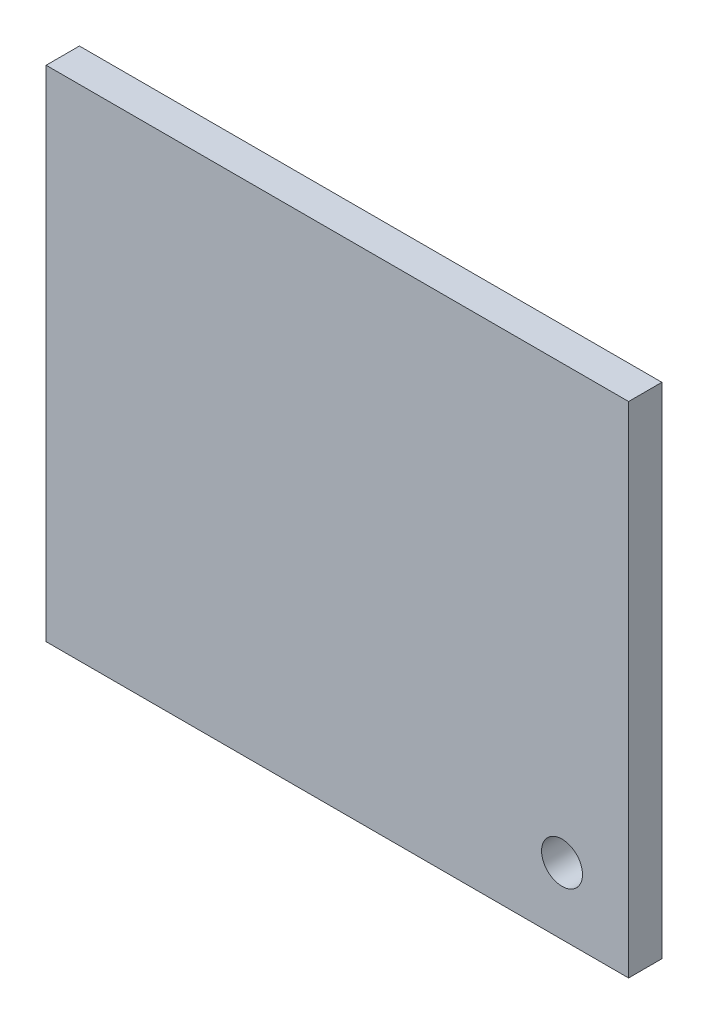
ISO-10303-21;
HEADER;
FILE_DESCRIPTION(('STEP AP214'),'2;1');
FILE_NAME('part.step','',(''),(''),'','','');
FILE_SCHEMA(('AUTOMOTIVE_DESIGN { 1 0 10303 214 1 1 1 1 }'));
ENDSEC;
DATA;
#1=APPLICATION_CONTEXT('core data for automotive mechanical design processes');
#2=APPLICATION_PROTOCOL_DEFINITION('international standard','automotive_design',2000,#1);
#3=PRODUCT_CONTEXT('',#1,'mechanical');
#4=PRODUCT('Part','Part','',(#3));
#5=PRODUCT_RELATED_PRODUCT_CATEGORY('part','',(#4));
#6=PRODUCT_DEFINITION_FORMATION('','',#4);
#7=PRODUCT_DEFINITION_CONTEXT('part definition',#1,'design');
#8=PRODUCT_DEFINITION('design','',#6,#7);
#9=PRODUCT_DEFINITION_SHAPE('','',#8);
#10=(LENGTH_UNIT() NAMED_UNIT(*) SI_UNIT(.MILLI.,.METRE.));
#11=(NAMED_UNIT(*) PLANE_ANGLE_UNIT() SI_UNIT($,.RADIAN.));
#12=(NAMED_UNIT(*) SI_UNIT($,.STERADIAN.) SOLID_ANGLE_UNIT());
#13=UNCERTAINTY_MEASURE_WITH_UNIT(LENGTH_MEASURE(1.E-05),#10,'distance_accuracy_value','');
#14=(GEOMETRIC_REPRESENTATION_CONTEXT(3) GLOBAL_UNCERTAINTY_ASSIGNED_CONTEXT((#13)) GLOBAL_UNIT_ASSIGNED_CONTEXT((#10,
#11,#12)) REPRESENTATION_CONTEXT('',''));
#15=CARTESIAN_POINT('',(0.,0.,0.));
#16=DIRECTION('',(0.,0.,1.));
#17=DIRECTION('',(1.,0.,0.));
#18=AXIS2_PLACEMENT_3D('',#15,#16,#17);
#19=CARTESIAN_POINT('',(17.5,-15.,2.));
#20=DIRECTION('',(-1.,0.,0.));
#21=DIRECTION('',(0.,0.,1.));
#22=AXIS2_PLACEMENT_3D('',#19,#20,#21);
#23=PLANE('',#22);
#24=DIRECTION('',(0.,1.,0.));
#25=VECTOR('',#24,1.);
#26=CARTESIAN_POINT('',(17.5,-15.,0.));
#27=LINE('',#26,#25);
#28=CARTESIAN_POINT('',(17.5,-15.,0.));
#29=VERTEX_POINT('',#28);
#30=CARTESIAN_POINT('',(17.5,15.,0.));
#31=VERTEX_POINT('',#30);
#32=EDGE_CURVE('E107',#29,#31,#27,.T.);
#33=ORIENTED_EDGE('',*,*,#32,.T.);
#34=DIRECTION('',(0.,0.,-1.));
#35=VECTOR('',#34,1.);
#36=CARTESIAN_POINT('',(17.5,15.,2.));
#37=LINE('',#36,#35);
#38=CARTESIAN_POINT('',(17.5,15.,2.));
#39=VERTEX_POINT('',#38);
#40=EDGE_CURVE('E11',#39,#31,#37,.T.);
#41=ORIENTED_EDGE('',*,*,#40,.F.);
#42=DIRECTION('',(0.,1.,0.));
#43=VECTOR('',#42,1.);
#44=CARTESIAN_POINT('',(17.5,-15.,2.));
#45=LINE('',#44,#43);
#46=CARTESIAN_POINT('',(17.5,-15.,2.));
#47=VERTEX_POINT('',#46);
#48=EDGE_CURVE('E91',#47,#39,#45,.T.);
#49=ORIENTED_EDGE('',*,*,#48,.F.);
#50=DIRECTION('',(0.,0.,-1.));
#51=VECTOR('',#50,1.);
#52=CARTESIAN_POINT('',(17.5,-15.,2.));
#53=LINE('',#52,#51);
#54=EDGE_CURVE('E103',#47,#29,#53,.T.);
#55=ORIENTED_EDGE('',*,*,#54,.T.);
#56=EDGE_LOOP('',(#33,#41,#49,#55));
#57=FACE_BOUND('',#56,.T.);
#58=ADVANCED_FACE('F39',(#57),#23,.F.);
#59=CARTESIAN_POINT('',(-17.5,15.,2.));
#60=DIRECTION('',(0.,-1.,0.));
#61=DIRECTION('',(0.,0.,-1.));
#62=AXIS2_PLACEMENT_3D('',#59,#60,#61);
#63=PLANE('',#62);
#64=DIRECTION('',(-1.,0.,0.));
#65=VECTOR('',#64,1.);
#66=CARTESIAN_POINT('',(-17.5,15.,0.));
#67=LINE('',#66,#65);
#68=CARTESIAN_POINT('',(-17.5,15.,0.));
#69=VERTEX_POINT('',#68);
#70=EDGE_CURVE('E96',#31,#69,#67,.T.);
#71=ORIENTED_EDGE('',*,*,#70,.T.);
#72=DIRECTION('',(0.,0.,-1.));
#73=VECTOR('',#72,1.);
#74=CARTESIAN_POINT('',(-17.5,15.,2.));
#75=LINE('',#74,#73);
#76=CARTESIAN_POINT('',(-17.5,15.,2.));
#77=VERTEX_POINT('',#76);
#78=EDGE_CURVE('E48',#77,#69,#75,.T.);
#79=ORIENTED_EDGE('',*,*,#78,.F.);
#80=DIRECTION('',(-1.,0.,0.));
#81=VECTOR('',#80,1.);
#82=CARTESIAN_POINT('',(-17.5,15.,2.));
#83=LINE('',#82,#81);
#84=EDGE_CURVE('E86',#39,#77,#83,.T.);
#85=ORIENTED_EDGE('',*,*,#84,.F.);
#86=ORIENTED_EDGE('',*,*,#40,.T.);
#87=EDGE_LOOP('',(#71,#79,#85,#86));
#88=FACE_BOUND('',#87,.T.);
#89=ADVANCED_FACE('F95',(#88),#63,.F.);
#90=CARTESIAN_POINT('',(-17.5,-15.,2.));
#91=DIRECTION('',(1.,0.,0.));
#92=DIRECTION('',(0.,0.,-1.));
#93=AXIS2_PLACEMENT_3D('',#90,#91,#92);
#94=PLANE('',#93);
#95=DIRECTION('',(0.,-1.,0.));
#96=VECTOR('',#95,1.);
#97=CARTESIAN_POINT('',(-17.5,-15.,0.));
#98=LINE('',#97,#96);
#99=CARTESIAN_POINT('',(-17.5,-15.,0.));
#100=VERTEX_POINT('',#99);
#101=EDGE_CURVE('E73',#69,#100,#98,.T.);
#102=ORIENTED_EDGE('',*,*,#101,.T.);
#103=DIRECTION('',(0.,0.,-1.));
#104=VECTOR('',#103,1.);
#105=CARTESIAN_POINT('',(-17.5,-15.,2.));
#106=LINE('',#105,#104);
#107=CARTESIAN_POINT('',(-17.5,-15.,2.));
#108=VERTEX_POINT('',#107);
#109=EDGE_CURVE('E98',#108,#100,#106,.T.);
#110=ORIENTED_EDGE('',*,*,#109,.F.);
#111=DIRECTION('',(0.,-1.,0.));
#112=VECTOR('',#111,1.);
#113=CARTESIAN_POINT('',(-17.5,-15.,2.));
#114=LINE('',#113,#112);
#115=EDGE_CURVE('E89',#77,#108,#114,.T.);
#116=ORIENTED_EDGE('',*,*,#115,.F.);
#117=ORIENTED_EDGE('',*,*,#78,.T.);
#118=EDGE_LOOP('',(#102,#110,#116,#117));
#119=FACE_BOUND('',#118,.T.);
#120=ADVANCED_FACE('F99',(#119),#94,.F.);
#121=CARTESIAN_POINT('',(-17.5,-15.,2.));
#122=DIRECTION('',(0.,1.,0.));
#123=DIRECTION('',(0.,0.,1.));
#124=AXIS2_PLACEMENT_3D('',#121,#122,#123);
#125=PLANE('',#124);
#126=DIRECTION('',(1.,0.,0.));
#127=VECTOR('',#126,1.);
#128=CARTESIAN_POINT('',(-17.5,-15.,0.));
#129=LINE('',#128,#127);
#130=EDGE_CURVE('E79',#100,#29,#129,.T.);
#131=ORIENTED_EDGE('',*,*,#130,.T.);
#132=ORIENTED_EDGE('',*,*,#54,.F.);
#133=DIRECTION('',(1.,0.,0.));
#134=VECTOR('',#133,1.);
#135=CARTESIAN_POINT('',(-17.5,-15.,2.));
#136=LINE('',#135,#134);
#137=EDGE_CURVE('E56',#108,#47,#136,.T.);
#138=ORIENTED_EDGE('',*,*,#137,.F.);
#139=ORIENTED_EDGE('',*,*,#109,.T.);
#140=EDGE_LOOP('',(#131,#132,#138,#139));
#141=FACE_BOUND('',#140,.T.);
#142=ADVANCED_FACE('F121',(#141),#125,.F.);
#143=CARTESIAN_POINT('',(0.,0.,2.));
#144=DIRECTION('',(0.,0.,-1.));
#145=DIRECTION('',(-1.,0.,0.));
#146=AXIS2_PLACEMENT_3D('',#143,#144,#145);
#147=PLANE('',#146);
#148=CARTESIAN_POINT('',(13.5,-11.,2.));
#149=DIRECTION('',(0.,0.,1.));
#150=DIRECTION('',(1.,0.,0.));
#151=AXIS2_PLACEMENT_3D('',#148,#149,#150);
#152=CIRCLE('',#151,1.23);
#153=CARTESIAN_POINT('',(14.73,-11.,2.));
#154=VERTEX_POINT('',#153);
#155=EDGE_CURVE('E128',#154,#154,#152,.T.);
#156=ORIENTED_EDGE('',*,*,#155,.F.);
#157=EDGE_LOOP('',(#156));
#158=FACE_BOUND('',#157,.T.);
#159=ORIENTED_EDGE('',*,*,#48,.T.);
#160=ORIENTED_EDGE('',*,*,#84,.T.);
#161=ORIENTED_EDGE('',*,*,#115,.T.);
#162=ORIENTED_EDGE('',*,*,#137,.T.);
#163=EDGE_LOOP('',(#159,#160,#161,#162));
#164=FACE_BOUND('',#163,.T.);
#165=ADVANCED_FACE('F87',(#158,#164),#147,.F.);
#166=CARTESIAN_POINT('',(0.,0.,0.));
#167=DIRECTION('',(0.,0.,-1.));
#168=DIRECTION('',(-1.,0.,0.));
#169=AXIS2_PLACEMENT_3D('',#166,#167,#168);
#170=PLANE('',#169);
#171=CARTESIAN_POINT('',(13.5,-11.,0.));
#172=DIRECTION('',(0.,0.,1.));
#173=DIRECTION('',(1.,0.,0.));
#174=AXIS2_PLACEMENT_3D('',#171,#172,#173);
#175=CIRCLE('',#174,1.23);
#176=CARTESIAN_POINT('',(14.73,-11.,0.));
#177=VERTEX_POINT('',#176);
#178=EDGE_CURVE('E111',#177,#177,#175,.T.);
#179=ORIENTED_EDGE('',*,*,#178,.T.);
#180=EDGE_LOOP('',(#179));
#181=FACE_BOUND('',#180,.T.);
#182=ORIENTED_EDGE('',*,*,#32,.F.);
#183=ORIENTED_EDGE('',*,*,#130,.F.);
#184=ORIENTED_EDGE('',*,*,#101,.F.);
#185=ORIENTED_EDGE('',*,*,#70,.F.);
#186=EDGE_LOOP('',(#182,#183,#184,#185));
#187=FACE_BOUND('',#186,.T.);
#188=ADVANCED_FACE('F124',(#181,#187),#170,.T.);
#189=CARTESIAN_POINT('',(13.5,-11.,0.));
#190=DIRECTION('',(0.,0.,1.));
#191=DIRECTION('',(1.,0.,0.));
#192=AXIS2_PLACEMENT_3D('',#189,#190,#191);
#193=CYLINDRICAL_SURFACE('',#192,1.23);
#194=ORIENTED_EDGE('',*,*,#178,.F.);
#195=EDGE_LOOP('',(#194));
#196=FACE_BOUND('',#195,.T.);
#197=ORIENTED_EDGE('',*,*,#155,.T.);
#198=EDGE_LOOP('',(#197));
#199=FACE_BOUND('',#198,.T.);
#200=ADVANCED_FACE('F137',(#196,#199),#193,.F.);
#201=CLOSED_SHELL('',(#58,#89,#120,#142,#165,#188,#200));
#202=MANIFOLD_SOLID_BREP('B2',#201);
#203=ADVANCED_BREP_SHAPE_REPRESENTATION('',(#18,#202),#14);
#204=SHAPE_DEFINITION_REPRESENTATION(#9,#203);
ENDSEC;
END-ISO-10303-21;
